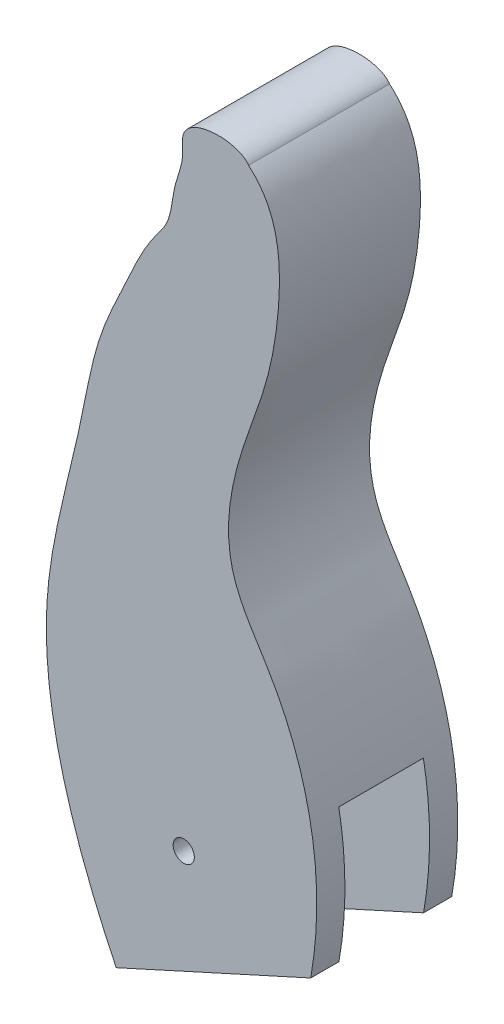
ISO-10303-21;
HEADER;
FILE_DESCRIPTION(('STEP AP214'),'2;1');
FILE_NAME('part.step','',(''),(''),'','','');
FILE_SCHEMA(('AUTOMOTIVE_DESIGN { 1 0 10303 214 1 1 1 1 }'));
ENDSEC;
DATA;
#1=APPLICATION_CONTEXT('core data for automotive mechanical design processes');
#2=APPLICATION_PROTOCOL_DEFINITION('international standard','automotive_design',2000,#1);
#3=PRODUCT_CONTEXT('',#1,'mechanical');
#4=PRODUCT('Part','Part','',(#3));
#5=PRODUCT_RELATED_PRODUCT_CATEGORY('part','',(#4));
#6=PRODUCT_DEFINITION_FORMATION('','',#4);
#7=PRODUCT_DEFINITION_CONTEXT('part definition',#1,'design');
#8=PRODUCT_DEFINITION('design','',#6,#7);
#9=PRODUCT_DEFINITION_SHAPE('','',#8);
#10=(LENGTH_UNIT() NAMED_UNIT(*) SI_UNIT(.MILLI.,.METRE.));
#11=(NAMED_UNIT(*) PLANE_ANGLE_UNIT() SI_UNIT($,.RADIAN.));
#12=(NAMED_UNIT(*) SI_UNIT($,.STERADIAN.) SOLID_ANGLE_UNIT());
#13=UNCERTAINTY_MEASURE_WITH_UNIT(LENGTH_MEASURE(1.E-05),#10,'distance_accuracy_value','');
#14=(GEOMETRIC_REPRESENTATION_CONTEXT(3) GLOBAL_UNCERTAINTY_ASSIGNED_CONTEXT((#13)) GLOBAL_UNIT_ASSIGNED_CONTEXT((#10,
#11,#12)) REPRESENTATION_CONTEXT('',''));
#15=CARTESIAN_POINT('',(0.,0.,0.));
#16=DIRECTION('',(0.,0.,1.));
#17=DIRECTION('',(1.,0.,0.));
#18=AXIS2_PLACEMENT_3D('',#15,#16,#17);
#19=CARTESIAN_POINT('',(26.0375397933297,-5.22199304887705,20.));
#20=DIRECTION('',(-0.413458887779533,0.910522788356289,0.));
#21=DIRECTION('',(-0.910522788356289,-0.413458887779533,0.));
#22=AXIS2_PLACEMENT_3D('',#19,#20,#21);
#23=PLANE('',#22);
#24=DIRECTION('',(-0.910522788356289,-0.413458887779533,0.));
#25=VECTOR('',#24,1.);
#26=CARTESIAN_POINT('',(26.0375397933297,-5.22199304887705,16.));
#27=LINE('',#26,#25);
#28=CARTESIAN_POINT('',(26.0375397933297,-5.22199304887705,16.));
#29=VERTEX_POINT('',#28);
#30=CARTESIAN_POINT('',(-1.5516725901672,-17.7499662228229,16.));
#31=VERTEX_POINT('',#30);
#32=EDGE_CURVE('E106',#29,#31,#27,.T.);
#33=ORIENTED_EDGE('',*,*,#32,.F.);
#34=DIRECTION('',(0.,0.,-1.));
#35=VECTOR('',#34,1.);
#36=CARTESIAN_POINT('',(26.0375397933297,-5.22199304887705,20.));
#37=LINE('',#36,#35);
#38=CARTESIAN_POINT('',(26.0375397933297,-5.22199304887705,20.));
#39=VERTEX_POINT('',#38);
#40=EDGE_CURVE('E171',#39,#29,#37,.T.);
#41=ORIENTED_EDGE('',*,*,#40,.F.);
#42=DIRECTION('',(0.910522788356289,0.413458887779533,0.));
#43=VECTOR('',#42,1.);
#44=CARTESIAN_POINT('',(26.0375397933297,-5.22199304887705,20.));
#45=LINE('',#44,#43);
#46=CARTESIAN_POINT('',(-1.5516725901672,-17.7499662228229,20.));
#47=VERTEX_POINT('',#46);
#48=EDGE_CURVE('E83',#47,#39,#45,.T.);
#49=ORIENTED_EDGE('',*,*,#48,.F.);
#50=DIRECTION('',(0.,0.,-1.));
#51=VECTOR('',#50,1.);
#52=CARTESIAN_POINT('',(-1.5516725901672,-17.7499662228229,20.));
#53=LINE('',#52,#51);
#54=EDGE_CURVE('E172',#47,#31,#53,.T.);
#55=ORIENTED_EDGE('',*,*,#54,.T.);
#56=EDGE_LOOP('',(#33,#41,#49,#55));
#57=FACE_BOUND('',#56,.T.);
#58=ADVANCED_FACE('F35',(#57),#23,.F.);
#59=CARTESIAN_POINT('',(17.22363369253,90.1754226099949,20.));
#60=CARTESIAN_POINT('',(15.79180585246,92.4001105371593,20.));
#61=CARTESIAN_POINT('',(7.09754211490856,92.2631132851455,20.));
#62=CARTESIAN_POINT('',(8.18270420069888,86.0992683231752,20.));
#63=CARTESIAN_POINT('',(6.38194140199325,82.3940789856416,20.));
#64=CARTESIAN_POINT('',(6.36887475158417,77.7649741927981,20.));
#65=CARTESIAN_POINT('',(2.63826549991768,73.3989349935607,20.));
#66=CARTESIAN_POINT('',(-0.122494467351885,67.0306593852741,20.));
#67=CARTESIAN_POINT('',(-4.542124050436,58.1664451750686,20.));
#68=CARTESIAN_POINT('',(-7.0544087818325,42.6172734486116,20.));
#69=CARTESIAN_POINT('',(-15.0945938542412,17.1662817602273,20.));
#70=CARTESIAN_POINT('',(-7.44407237682863,-5.58456411069387,20.));
#71=CARTESIAN_POINT('',(-1.55167259016719,-17.7499662228229,20.));
#72=B_SPLINE_CURVE_WITH_KNOTS('',3,(#59,#60,#61,#62,#63,#64,#65,#66,#67,#68,#69,#70,#71),
.UNSPECIFIED.,.F.,.F.,(4,1,1,1,1,1,1,1,1,1,4),(0.,0.0827654505829908,0.103118319021695,
0.139065356363045,0.183083747638487,0.210570147036609,0.276498686012843,0.353940751581467,
0.452684436710728,0.662009038475953,1.),.UNSPECIFIED.);
#73=DIRECTION('',(0.,0.,-1.));
#74=VECTOR('',#73,1.);
#75=SURFACE_OF_LINEAR_EXTRUSION('',#72,#74);
#76=CARTESIAN_POINT('',(-1.5516725901672,-17.7499662228229,4.));
#77=VERTEX_POINT('',#76);
#78=CARTESIAN_POINT('',(-1.5516725901672,-17.7499662228229,0.));
#79=VERTEX_POINT('',#78);
#80=EDGE_CURVE('E175',#77,#79,#53,.T.);
#81=ORIENTED_EDGE('',*,*,#80,.F.);
#82=CARTESIAN_POINT('',(17.22363369253,90.1754226099949,4.));
#83=CARTESIAN_POINT('',(15.79180585246,92.4001105371593,4.));
#84=CARTESIAN_POINT('',(7.09754211490856,92.2631132851455,4.));
#85=CARTESIAN_POINT('',(8.18270420069888,86.0992683231752,4.));
#86=CARTESIAN_POINT('',(6.38194140199325,82.3940789856416,4.));
#87=CARTESIAN_POINT('',(6.36887475158417,77.7649741927981,4.));
#88=CARTESIAN_POINT('',(2.63826549991768,73.3989349935607,4.));
#89=CARTESIAN_POINT('',(-0.122494467351885,67.0306593852741,4.));
#90=CARTESIAN_POINT('',(-4.542124050436,58.1664451750686,4.));
#91=CARTESIAN_POINT('',(-7.0544087818325,42.6172734486116,4.));
#92=CARTESIAN_POINT('',(-15.0945938542412,17.1662817602273,4.));
#93=CARTESIAN_POINT('',(-7.44407237682863,-5.58456411069387,4.));
#94=CARTESIAN_POINT('',(-1.55167259016719,-17.7499662228229,4.));
#95=B_SPLINE_CURVE_WITH_KNOTS('',3,(#82,#83,#84,#85,#86,#87,#88,#89,#90,#91,#92,#93,#94),
.UNSPECIFIED.,.F.,.F.,(4,1,1,1,1,1,1,1,1,1,4),(0.,0.0827654505829908,0.103118319021695,
0.139065356363045,0.183083747638487,0.210570147036609,0.276498686012843,0.353940751581467,
0.452684436710728,0.662009038475953,1.),.UNSPECIFIED.);
#96=CARTESIAN_POINT('',(-11.2174358607023,13.7816299138479,4.));
#97=VERTEX_POINT('',#96);
#98=EDGE_CURVE('E124',#77,#97,#95,.F.);
#99=ORIENTED_EDGE('',*,*,#98,.T.);
#100=DIRECTION('',(0.,0.,-1.));
#101=VECTOR('',#100,1.);
#102=CARTESIAN_POINT('',(-11.2174358607023,13.7816299138479,20.));
#103=LINE('',#102,#101);
#104=CARTESIAN_POINT('',(-11.2174358607023,13.7816299138479,16.));
#105=VERTEX_POINT('',#104);
#106=EDGE_CURVE('E115',#97,#105,#103,.F.);
#107=ORIENTED_EDGE('',*,*,#106,.T.);
#108=CARTESIAN_POINT('',(17.22363369253,90.1754226099949,16.));
#109=CARTESIAN_POINT('',(15.79180585246,92.4001105371593,16.));
#110=CARTESIAN_POINT('',(7.09754211490856,92.2631132851455,16.));
#111=CARTESIAN_POINT('',(8.18270420069888,86.0992683231752,16.));
#112=CARTESIAN_POINT('',(6.38194140199325,82.3940789856416,16.));
#113=CARTESIAN_POINT('',(6.36887475158417,77.7649741927981,16.));
#114=CARTESIAN_POINT('',(2.63826549991768,73.3989349935607,16.));
#115=CARTESIAN_POINT('',(-0.122494467351885,67.0306593852741,16.));
#116=CARTESIAN_POINT('',(-4.542124050436,58.1664451750686,16.));
#117=CARTESIAN_POINT('',(-7.0544087818325,42.6172734486116,16.));
#118=CARTESIAN_POINT('',(-15.0945938542412,17.1662817602273,16.));
#119=CARTESIAN_POINT('',(-7.44407237682863,-5.58456411069387,16.));
#120=CARTESIAN_POINT('',(-1.55167259016719,-17.7499662228229,16.));
#121=B_SPLINE_CURVE_WITH_KNOTS('',3,(#108,#109,#110,#111,#112,#113,#114,#115,#116,#117,#118,
#119,#120),.UNSPECIFIED.,.F.,.F.,(4,1,1,1,1,1,1,1,1,1,4),(0.,0.0827654505829908,
0.103118319021695,0.139065356363045,0.183083747638487,0.210570147036609,0.276498686012843,
0.353940751581467,0.452684436710728,0.662009038475953,1.),.UNSPECIFIED.);
#122=EDGE_CURVE('E103',#31,#105,#121,.F.);
#123=ORIENTED_EDGE('',*,*,#122,.F.);
#124=ORIENTED_EDGE('',*,*,#54,.F.);
#125=CARTESIAN_POINT('',(17.22363369253,90.1754226099949,20.));
#126=VERTEX_POINT('',#125);
#127=EDGE_CURVE('E134',#126,#47,#72,.T.);
#128=ORIENTED_EDGE('',*,*,#127,.F.);
#129=DIRECTION('',(0.,0.,-1.));
#130=VECTOR('',#129,1.);
#131=CARTESIAN_POINT('',(17.22363369253,90.1754226099949,20.));
#132=LINE('',#131,#130);
#133=CARTESIAN_POINT('',(17.22363369253,90.1754226099949,0.));
#134=VERTEX_POINT('',#133);
#135=EDGE_CURVE('E146',#126,#134,#132,.T.);
#136=ORIENTED_EDGE('',*,*,#135,.T.);
#137=CARTESIAN_POINT('',(17.22363369253,90.1754226099949,0.));
#138=CARTESIAN_POINT('',(15.79180585246,92.4001105371593,0.));
#139=CARTESIAN_POINT('',(7.09754211490856,92.2631132851455,0.));
#140=CARTESIAN_POINT('',(8.18270420069888,86.0992683231752,0.));
#141=CARTESIAN_POINT('',(6.38194140199325,82.3940789856416,0.));
#142=CARTESIAN_POINT('',(6.36887475158417,77.7649741927981,0.));
#143=CARTESIAN_POINT('',(2.63826549991768,73.3989349935607,0.));
#144=CARTESIAN_POINT('',(-0.122494467351885,67.0306593852741,0.));
#145=CARTESIAN_POINT('',(-4.542124050436,58.1664451750686,0.));
#146=CARTESIAN_POINT('',(-7.0544087818325,42.6172734486116,0.));
#147=CARTESIAN_POINT('',(-15.0945938542412,17.1662817602273,0.));
#148=CARTESIAN_POINT('',(-7.44407237682863,-5.58456411069387,0.));
#149=CARTESIAN_POINT('',(-1.55167259016719,-17.7499662228229,0.));
#150=B_SPLINE_CURVE_WITH_KNOTS('',3,(#137,#138,#139,#140,#141,#142,#143,#144,#145,#146,#147,
#148,#149),.UNSPECIFIED.,.F.,.F.,(4,1,1,1,1,1,1,1,1,1,4),(0.,0.0827654505829908,
0.103118319021695,0.139065356363045,0.183083747638487,0.210570147036609,0.276498686012843,
0.353940751581467,0.452684436710728,0.662009038475953,1.),.UNSPECIFIED.);
#151=EDGE_CURVE('E125',#134,#79,#150,.T.);
#152=ORIENTED_EDGE('',*,*,#151,.T.);
#153=EDGE_LOOP('',(#81,#99,#107,#123,#124,#128,#136,#152));
#154=FACE_BOUND('',#153,.T.);
#155=ADVANCED_FACE('F37',(#154),#75,.F.);
#156=CARTESIAN_POINT('',(26.0375397933297,-5.22199304887705,4.));
#157=VERTEX_POINT('',#156);
#158=CARTESIAN_POINT('',(26.0375397933297,-5.22199304887705,0.));
#159=VERTEX_POINT('',#158);
#160=EDGE_CURVE('E176',#157,#159,#37,.T.);
#161=ORIENTED_EDGE('',*,*,#160,.F.);
#162=DIRECTION('',(-0.910522788356289,-0.413458887779533,0.));
#163=VECTOR('',#162,1.);
#164=CARTESIAN_POINT('',(26.0375397933297,-5.22199304887705,4.));
#165=LINE('',#164,#163);
#166=EDGE_CURVE('E110',#157,#77,#165,.T.);
#167=ORIENTED_EDGE('',*,*,#166,.T.);
#168=ORIENTED_EDGE('',*,*,#80,.T.);
#169=DIRECTION('',(0.910522788356289,0.413458887779533,0.));
#170=VECTOR('',#169,1.);
#171=CARTESIAN_POINT('',(26.0375397933297,-5.22199304887705,0.));
#172=LINE('',#171,#170);
#173=EDGE_CURVE('E128',#79,#159,#172,.T.);
#174=ORIENTED_EDGE('',*,*,#173,.T.);
#175=EDGE_LOOP('',(#161,#167,#168,#174));
#176=FACE_BOUND('',#175,.T.);
#177=ADVANCED_FACE('F158',(#176),#23,.F.);
#178=CARTESIAN_POINT('',(26.0375397933297,-5.22199304887705,20.));
#179=CARTESIAN_POINT('',(28.1613660702041,6.65632669499589,20.));
#180=CARTESIAN_POINT('',(25.7985441442533,22.5129993106937,20.));
#181=CARTESIAN_POINT('',(12.8632482335775,39.7468996761768,20.));
#182=CARTESIAN_POINT('',(15.2566464612531,52.8633169212322,20.));
#183=CARTESIAN_POINT('',(19.9775845825062,64.3866707855305,20.));
#184=CARTESIAN_POINT('',(22.1770447170999,76.5342599422495,20.));
#185=CARTESIAN_POINT('',(21.4389134378265,86.6279658103359,20.));
#186=CARTESIAN_POINT('',(17.22363369253,90.1754226099949,20.));
#187=B_SPLINE_CURVE_WITH_KNOTS('',3,(#178,#179,#180,#181,#182,#183,#184,#185,#186),
.UNSPECIFIED.,.F.,.F.,(4,1,1,1,1,1,4),(0.,0.355758378204422,0.46365050443763,0.62650725286804,
0.720504820453282,0.842995871244195,1.),.UNSPECIFIED.);
#188=DIRECTION('',(0.,0.,-1.));
#189=VECTOR('',#188,1.);
#190=SURFACE_OF_LINEAR_EXTRUSION('',#187,#189);
#191=DIRECTION('',(0.,0.,-1.));
#192=VECTOR('',#191,1.);
#193=CARTESIAN_POINT('',(26.0158210967447,13.7816299138479,20.));
#194=LINE('',#193,#192);
#195=CARTESIAN_POINT('',(26.0158210967116,13.7816299140241,16.));
#196=VERTEX_POINT('',#195);
#197=CARTESIAN_POINT('',(26.0158210967116,13.7816299138479,4.));
#198=VERTEX_POINT('',#197);
#199=EDGE_CURVE('E45',#196,#198,#194,.T.);
#200=ORIENTED_EDGE('',*,*,#199,.T.);
#201=CARTESIAN_POINT('',(26.0375397933297,-5.22199304887705,4.));
#202=CARTESIAN_POINT('',(28.1613660702041,6.65632669499589,4.));
#203=CARTESIAN_POINT('',(25.7985441442533,22.5129993106937,4.));
#204=CARTESIAN_POINT('',(12.8632482335775,39.7468996761768,4.));
#205=CARTESIAN_POINT('',(15.2566464612531,52.8633169212322,4.));
#206=CARTESIAN_POINT('',(19.9775845825062,64.3866707855305,4.));
#207=CARTESIAN_POINT('',(22.1770447170999,76.5342599422495,4.));
#208=CARTESIAN_POINT('',(21.4389134378265,86.6279658103359,4.));
#209=CARTESIAN_POINT('',(17.22363369253,90.1754226099949,4.));
#210=B_SPLINE_CURVE_WITH_KNOTS('',3,(#201,#202,#203,#204,#205,#206,#207,#208,#209),
.UNSPECIFIED.,.F.,.F.,(4,1,1,1,1,1,4),(0.,0.355758378204422,0.46365050443763,0.62650725286804,
0.720504820453282,0.842995871244195,1.),.UNSPECIFIED.);
#211=EDGE_CURVE('E11',#198,#157,#210,.F.);
#212=ORIENTED_EDGE('',*,*,#211,.T.);
#213=ORIENTED_EDGE('',*,*,#160,.T.);
#214=CARTESIAN_POINT('',(26.0375397933297,-5.22199304887705,0.));
#215=CARTESIAN_POINT('',(28.1613660702041,6.65632669499589,0.));
#216=CARTESIAN_POINT('',(25.7985441442533,22.5129993106937,0.));
#217=CARTESIAN_POINT('',(12.8632482335775,39.7468996761768,0.));
#218=CARTESIAN_POINT('',(15.2566464612531,52.8633169212322,0.));
#219=CARTESIAN_POINT('',(19.9775845825062,64.3866707855305,0.));
#220=CARTESIAN_POINT('',(22.1770447170999,76.5342599422495,0.));
#221=CARTESIAN_POINT('',(21.4389134378265,86.6279658103359,0.));
#222=CARTESIAN_POINT('',(17.22363369253,90.1754226099949,0.));
#223=B_SPLINE_CURVE_WITH_KNOTS('',3,(#214,#215,#216,#217,#218,#219,#220,#221,#222),
.UNSPECIFIED.,.F.,.F.,(4,1,1,1,1,1,4),(0.,0.355758378204422,0.46365050443763,0.62650725286804,
0.720504820453282,0.842995871244195,1.),.UNSPECIFIED.);
#224=EDGE_CURVE('E77',#159,#134,#223,.T.);
#225=ORIENTED_EDGE('',*,*,#224,.T.);
#226=ORIENTED_EDGE('',*,*,#135,.F.);
#227=EDGE_CURVE('E61',#39,#126,#187,.T.);
#228=ORIENTED_EDGE('',*,*,#227,.F.);
#229=ORIENTED_EDGE('',*,*,#40,.T.);
#230=CARTESIAN_POINT('',(26.0375397933297,-5.22199304887705,16.));
#231=CARTESIAN_POINT('',(28.1613660702041,6.65632669499589,16.));
#232=CARTESIAN_POINT('',(25.7985441442533,22.5129993106937,16.));
#233=CARTESIAN_POINT('',(12.8632482335775,39.7468996761768,16.));
#234=CARTESIAN_POINT('',(15.2566464612531,52.8633169212322,16.));
#235=CARTESIAN_POINT('',(19.9775845825062,64.3866707855305,16.));
#236=CARTESIAN_POINT('',(22.1770447170999,76.5342599422495,16.));
#237=CARTESIAN_POINT('',(21.4389134378265,86.6279658103359,16.));
#238=CARTESIAN_POINT('',(17.22363369253,90.1754226099949,16.));
#239=B_SPLINE_CURVE_WITH_KNOTS('',3,(#230,#231,#232,#233,#234,#235,#236,#237,#238),
.UNSPECIFIED.,.F.,.F.,(4,1,1,1,1,1,4),(0.,0.355758378204422,0.46365050443763,0.62650725286804,
0.720504820453282,0.842995871244195,1.),.UNSPECIFIED.);
#240=EDGE_CURVE('E174',#196,#29,#239,.F.);
#241=ORIENTED_EDGE('',*,*,#240,.F.);
#242=EDGE_LOOP('',(#200,#212,#213,#225,#226,#228,#229,#241));
#243=FACE_BOUND('',#242,.T.);
#244=ADVANCED_FACE('F154',(#243),#190,.F.);
#245=CARTESIAN_POINT('',(-7.81122999359801,41.4416034362661,20.));
#246=DIRECTION('',(0.,0.,-1.));
#247=DIRECTION('',(-1.,0.,0.));
#248=AXIS2_PLACEMENT_3D('',#245,#246,#247);
#249=PLANE('',#248);
#250=CARTESIAN_POINT('',(8.02928163732308,1.36258820252323,20.));
#251=DIRECTION('',(0.,0.,1.));
#252=DIRECTION('',(1.,0.,0.));
#253=AXIS2_PLACEMENT_3D('',#250,#251,#252);
#254=CIRCLE('',#253,1.5);
#255=CARTESIAN_POINT('',(9.52928163732308,1.36258820252323,20.));
#256=VERTEX_POINT('',#255);
#257=EDGE_CURVE('E236',#256,#256,#254,.T.);
#258=ORIENTED_EDGE('',*,*,#257,.F.);
#259=EDGE_LOOP('',(#258));
#260=FACE_BOUND('',#259,.T.);
#261=ORIENTED_EDGE('',*,*,#127,.T.);
#262=ORIENTED_EDGE('',*,*,#48,.T.);
#263=ORIENTED_EDGE('',*,*,#227,.T.);
#264=EDGE_LOOP('',(#261,#262,#263));
#265=FACE_BOUND('',#264,.T.);
#266=ADVANCED_FACE('F157',(#260,#265),#249,.F.);
#267=CARTESIAN_POINT('',(-7.81122999359801,41.4416034362661,0.));
#268=DIRECTION('',(0.,0.,-1.));
#269=DIRECTION('',(-1.,0.,0.));
#270=AXIS2_PLACEMENT_3D('',#267,#268,#269);
#271=PLANE('',#270);
#272=CARTESIAN_POINT('',(8.02928163732308,1.36258820252323,0.));
#273=DIRECTION('',(0.,0.,-1.));
#274=DIRECTION('',(-1.,0.,0.));
#275=AXIS2_PLACEMENT_3D('',#272,#273,#274);
#276=CIRCLE('',#275,1.5);
#277=CARTESIAN_POINT('',(6.52928163732308,1.36258820252323,0.));
#278=VERTEX_POINT('',#277);
#279=EDGE_CURVE('E120',#278,#278,#276,.T.);
#280=ORIENTED_EDGE('',*,*,#279,.F.);
#281=EDGE_LOOP('',(#280));
#282=FACE_BOUND('',#281,.T.);
#283=ORIENTED_EDGE('',*,*,#151,.F.);
#284=ORIENTED_EDGE('',*,*,#224,.F.);
#285=ORIENTED_EDGE('',*,*,#173,.F.);
#286=EDGE_LOOP('',(#283,#284,#285));
#287=FACE_BOUND('',#286,.T.);
#288=ADVANCED_FACE('F159',(#282,#287),#271,.T.);
#289=CARTESIAN_POINT('',(-20.664536888312,13.7816299138479,4.));
#290=DIRECTION('',(0.,1.,0.));
#291=DIRECTION('',(0.,0.,1.));
#292=AXIS2_PLACEMENT_3D('',#289,#290,#291);
#293=PLANE('',#292);
#294=DIRECTION('',(-1.,0.,0.));
#295=VECTOR('',#294,1.);
#296=CARTESIAN_POINT('',(-20.664536888312,13.7816299138479,4.));
#297=LINE('',#296,#295);
#298=EDGE_CURVE('E119',#198,#97,#297,.T.);
#299=ORIENTED_EDGE('',*,*,#298,.F.);
#300=ORIENTED_EDGE('',*,*,#199,.F.);
#301=DIRECTION('',(-1.,0.,0.));
#302=VECTOR('',#301,1.);
#303=CARTESIAN_POINT('',(-20.664536888312,13.7816299138479,16.));
#304=LINE('',#303,#302);
#305=EDGE_CURVE('E52',#196,#105,#304,.T.);
#306=ORIENTED_EDGE('',*,*,#305,.T.);
#307=ORIENTED_EDGE('',*,*,#106,.F.);
#308=EDGE_LOOP('',(#299,#300,#306,#307));
#309=FACE_BOUND('',#308,.T.);
#310=ADVANCED_FACE('F114',(#309),#293,.F.);
#311=CARTESIAN_POINT('',(0.,0.,4.));
#312=DIRECTION('',(0.,0.,-1.));
#313=DIRECTION('',(-1.,0.,0.));
#314=AXIS2_PLACEMENT_3D('',#311,#312,#313);
#315=PLANE('',#314);
#316=CARTESIAN_POINT('',(8.02928163732308,1.36258820252323,4.));
#317=DIRECTION('',(0.,0.,-1.));
#318=DIRECTION('',(-1.,0.,0.));
#319=AXIS2_PLACEMENT_3D('',#316,#317,#318);
#320=CIRCLE('',#319,1.5);
#321=CARTESIAN_POINT('',(6.52928163732308,1.36258820252323,4.));
#322=VERTEX_POINT('',#321);
#323=EDGE_CURVE('E238',#322,#322,#320,.T.);
#324=ORIENTED_EDGE('',*,*,#323,.T.);
#325=EDGE_LOOP('',(#324));
#326=FACE_BOUND('',#325,.T.);
#327=ORIENTED_EDGE('',*,*,#166,.F.);
#328=ORIENTED_EDGE('',*,*,#211,.F.);
#329=ORIENTED_EDGE('',*,*,#298,.T.);
#330=ORIENTED_EDGE('',*,*,#98,.F.);
#331=EDGE_LOOP('',(#327,#328,#329,#330));
#332=FACE_BOUND('',#331,.T.);
#333=ADVANCED_FACE('F216',(#326,#332),#315,.F.);
#334=CARTESIAN_POINT('',(0.,0.,16.));
#335=DIRECTION('',(0.,0.,-1.));
#336=DIRECTION('',(-1.,0.,0.));
#337=AXIS2_PLACEMENT_3D('',#334,#335,#336);
#338=PLANE('',#337);
#339=CARTESIAN_POINT('',(8.02928163732308,1.36258820252323,16.));
#340=DIRECTION('',(0.,0.,-1.));
#341=DIRECTION('',(-1.,0.,0.));
#342=AXIS2_PLACEMENT_3D('',#339,#340,#341);
#343=CIRCLE('',#342,1.5);
#344=CARTESIAN_POINT('',(6.52928163732308,1.36258820252323,16.));
#345=VERTEX_POINT('',#344);
#346=EDGE_CURVE('E40',#345,#345,#343,.T.);
#347=ORIENTED_EDGE('',*,*,#346,.F.);
#348=EDGE_LOOP('',(#347));
#349=FACE_BOUND('',#348,.T.);
#350=ORIENTED_EDGE('',*,*,#122,.T.);
#351=ORIENTED_EDGE('',*,*,#305,.F.);
#352=ORIENTED_EDGE('',*,*,#240,.T.);
#353=ORIENTED_EDGE('',*,*,#32,.T.);
#354=EDGE_LOOP('',(#350,#351,#352,#353));
#355=FACE_BOUND('',#354,.T.);
#356=ADVANCED_FACE('F104',(#349,#355),#338,.T.);
#357=CARTESIAN_POINT('',(8.02928163732308,1.36258820252323,-16.));
#358=DIRECTION('',(0.,0.,1.));
#359=DIRECTION('',(1.,0.,0.));
#360=AXIS2_PLACEMENT_3D('',#357,#358,#359);
#361=CYLINDRICAL_SURFACE('',#360,1.5);
#362=ORIENTED_EDGE('',*,*,#346,.T.);
#363=EDGE_LOOP('',(#362));
#364=FACE_BOUND('',#363,.T.);
#365=ORIENTED_EDGE('',*,*,#257,.T.);
#366=EDGE_LOOP('',(#365));
#367=FACE_BOUND('',#366,.T.);
#368=ADVANCED_FACE('F219',(#364,#367),#361,.F.);
#369=ORIENTED_EDGE('',*,*,#279,.T.);
#370=EDGE_LOOP('',(#369));
#371=FACE_BOUND('',#370,.T.);
#372=ORIENTED_EDGE('',*,*,#323,.F.);
#373=EDGE_LOOP('',(#372));
#374=FACE_BOUND('',#373,.T.);
#375=ADVANCED_FACE('F225',(#371,#374),#361,.F.);
#376=CLOSED_SHELL('',(#58,#155,#177,#244,#266,#288,#310,#333,#356,#368,#375));
#377=MANIFOLD_SOLID_BREP('B2',#376);
#378=ADVANCED_BREP_SHAPE_REPRESENTATION('',(#18,#377),#14);
#379=SHAPE_DEFINITION_REPRESENTATION(#9,#378);
ENDSEC;
END-ISO-10303-21;
